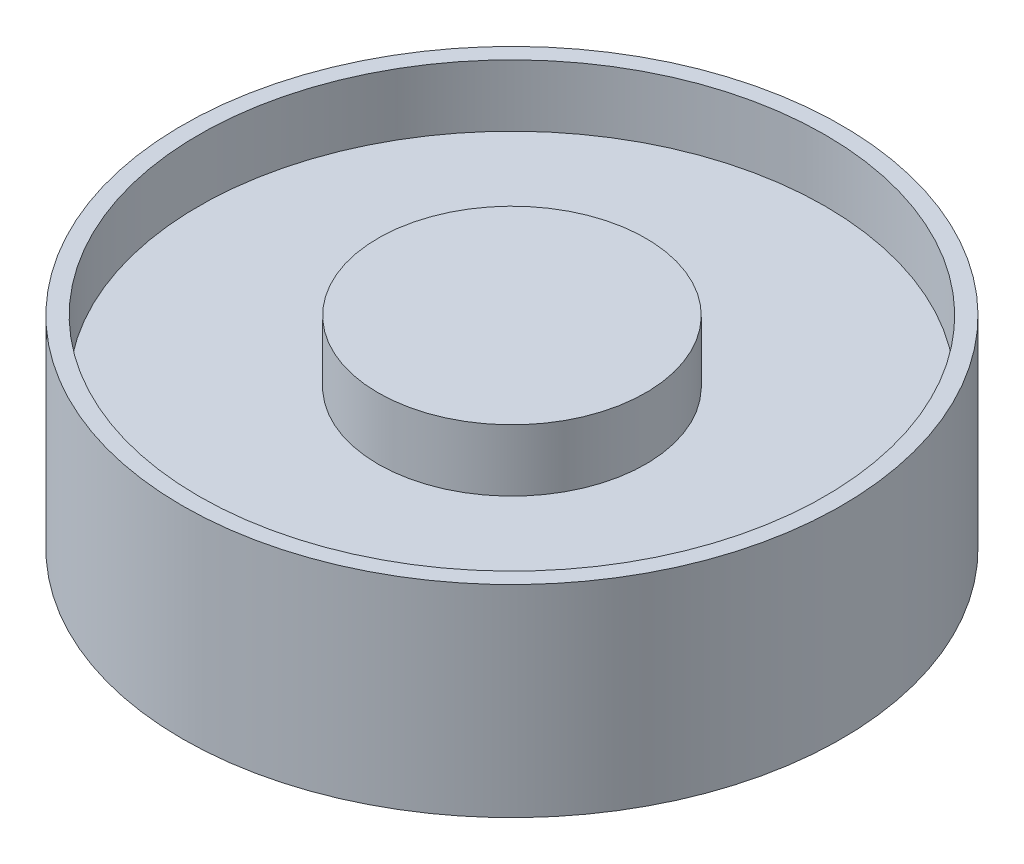
ISO-10303-21;
HEADER;
FILE_DESCRIPTION(('STEP AP214'),'2;1');
FILE_NAME('part.step','',(''),(''),'','','');
FILE_SCHEMA(('AUTOMOTIVE_DESIGN { 1 0 10303 214 1 1 1 1 }'));
ENDSEC;
DATA;
#1=APPLICATION_CONTEXT('core data for automotive mechanical design processes');
#2=APPLICATION_PROTOCOL_DEFINITION('international standard','automotive_design',2000,#1);
#3=PRODUCT_CONTEXT('',#1,'mechanical');
#4=PRODUCT('Part','Part','',(#3));
#5=PRODUCT_RELATED_PRODUCT_CATEGORY('part','',(#4));
#6=PRODUCT_DEFINITION_FORMATION('','',#4);
#7=PRODUCT_DEFINITION_CONTEXT('part definition',#1,'design');
#8=PRODUCT_DEFINITION('design','',#6,#7);
#9=PRODUCT_DEFINITION_SHAPE('','',#8);
#10=(LENGTH_UNIT() NAMED_UNIT(*) SI_UNIT(.MILLI.,.METRE.));
#11=(NAMED_UNIT(*) PLANE_ANGLE_UNIT() SI_UNIT($,.RADIAN.));
#12=(NAMED_UNIT(*) SI_UNIT($,.STERADIAN.) SOLID_ANGLE_UNIT());
#13=UNCERTAINTY_MEASURE_WITH_UNIT(LENGTH_MEASURE(1.E-05),#10,'distance_accuracy_value','');
#14=(GEOMETRIC_REPRESENTATION_CONTEXT(3) GLOBAL_UNCERTAINTY_ASSIGNED_CONTEXT((#13)) GLOBAL_UNIT_ASSIGNED_CONTEXT((#10,
#11,#12)) REPRESENTATION_CONTEXT('',''));
#15=CARTESIAN_POINT('',(0.,0.,0.));
#16=DIRECTION('',(0.,0.,1.));
#17=DIRECTION('',(1.,0.,0.));
#18=AXIS2_PLACEMENT_3D('',#15,#16,#17);
#19=CARTESIAN_POINT('',(0.,3.4,0.));
#20=DIRECTION('',(0.,-1.,0.));
#21=DIRECTION('',(0.,0.,-1.));
#22=AXIS2_PLACEMENT_3D('',#19,#20,#21);
#23=CYLINDRICAL_SURFACE('',#22,8.);
#24=CARTESIAN_POINT('',(0.,0.,0.));
#25=DIRECTION('',(0.,1.,0.));
#26=DIRECTION('',(0.,0.,1.));
#27=AXIS2_PLACEMENT_3D('',#24,#25,#26);
#28=CIRCLE('',#27,8.);
#29=CARTESIAN_POINT('',(0.,0.,8.));
#30=VERTEX_POINT('',#29);
#31=EDGE_CURVE('E45',#30,#30,#28,.T.);
#32=ORIENTED_EDGE('',*,*,#31,.T.);
#33=EDGE_LOOP('',(#32));
#34=FACE_BOUND('',#33,.T.);
#35=CARTESIAN_POINT('',(0.,4.9,0.));
#36=DIRECTION('',(0.,1.,0.));
#37=DIRECTION('',(0.,0.,1.));
#38=AXIS2_PLACEMENT_3D('',#35,#36,#37);
#39=CIRCLE('',#38,8.);
#40=CARTESIAN_POINT('',(0.,4.9,8.));
#41=VERTEX_POINT('',#40);
#42=EDGE_CURVE('E49',#41,#41,#39,.T.);
#43=ORIENTED_EDGE('',*,*,#42,.F.);
#44=EDGE_LOOP('',(#43));
#45=FACE_BOUND('',#44,.T.);
#46=ADVANCED_FACE('F39',(#34,#45),#23,.T.);
#47=CARTESIAN_POINT('',(0.,0.,0.));
#48=DIRECTION('',(0.,1.,0.));
#49=DIRECTION('',(0.,0.,1.));
#50=AXIS2_PLACEMENT_3D('',#47,#48,#49);
#51=PLANE('',#50);
#52=ORIENTED_EDGE('',*,*,#31,.F.);
#53=EDGE_LOOP('',(#52));
#54=FACE_BOUND('',#53,.T.);
#55=ADVANCED_FACE('F86',(#54),#51,.F.);
#56=CARTESIAN_POINT('',(0.,4.9,0.));
#57=DIRECTION('',(0.,-1.,0.));
#58=DIRECTION('',(0.,0.,-1.));
#59=AXIS2_PLACEMENT_3D('',#56,#57,#58);
#60=CYLINDRICAL_SURFACE('',#59,7.6);
#61=CARTESIAN_POINT('',(0.,4.9,0.));
#62=DIRECTION('',(0.,1.,0.));
#63=DIRECTION('',(0.,0.,1.));
#64=AXIS2_PLACEMENT_3D('',#61,#62,#63);
#65=CIRCLE('',#64,7.6);
#66=CARTESIAN_POINT('',(0.,4.9,7.6));
#67=VERTEX_POINT('',#66);
#68=EDGE_CURVE('E53',#67,#67,#65,.T.);
#69=ORIENTED_EDGE('',*,*,#68,.T.);
#70=EDGE_LOOP('',(#69));
#71=FACE_BOUND('',#70,.T.);
#72=CARTESIAN_POINT('',(0.,3.4,0.));
#73=DIRECTION('',(0.,1.,0.));
#74=DIRECTION('',(0.,0.,1.));
#75=AXIS2_PLACEMENT_3D('',#72,#73,#74);
#76=CIRCLE('',#75,7.6);
#77=CARTESIAN_POINT('',(0.,3.4,7.6));
#78=VERTEX_POINT('',#77);
#79=EDGE_CURVE('E11',#78,#78,#76,.F.);
#80=ORIENTED_EDGE('',*,*,#79,.T.);
#81=EDGE_LOOP('',(#80));
#82=FACE_BOUND('',#81,.T.);
#83=ADVANCED_FACE('F81',(#71,#82),#60,.F.);
#84=CARTESIAN_POINT('',(0.,4.9,0.));
#85=DIRECTION('',(0.,1.,0.));
#86=DIRECTION('',(0.,0.,1.));
#87=AXIS2_PLACEMENT_3D('',#84,#85,#86);
#88=PLANE('',#87);
#89=ORIENTED_EDGE('',*,*,#68,.F.);
#90=EDGE_LOOP('',(#89));
#91=FACE_BOUND('',#90,.T.);
#92=ORIENTED_EDGE('',*,*,#42,.T.);
#93=EDGE_LOOP('',(#92));
#94=FACE_BOUND('',#93,.T.);
#95=ADVANCED_FACE('F76',(#91,#94),#88,.T.);
#96=CARTESIAN_POINT('',(0.,3.4,0.));
#97=DIRECTION('',(0.,1.,0.));
#98=DIRECTION('',(0.,0.,1.));
#99=AXIS2_PLACEMENT_3D('',#96,#97,#98);
#100=PLANE('',#99);
#101=CARTESIAN_POINT('',(0.,3.4,0.));
#102=DIRECTION('',(0.,1.,0.));
#103=DIRECTION('',(0.,0.,1.));
#104=AXIS2_PLACEMENT_3D('',#101,#102,#103);
#105=CIRCLE('',#104,3.25);
#106=CARTESIAN_POINT('',(0.,3.4,3.25));
#107=VERTEX_POINT('',#106);
#108=EDGE_CURVE('E59',#107,#107,#105,.T.);
#109=ORIENTED_EDGE('',*,*,#108,.F.);
#110=EDGE_LOOP('',(#109));
#111=FACE_BOUND('',#110,.T.);
#112=ORIENTED_EDGE('',*,*,#79,.F.);
#113=EDGE_LOOP('',(#112));
#114=FACE_BOUND('',#113,.T.);
#115=ADVANCED_FACE('F70',(#111,#114),#100,.T.);
#116=CARTESIAN_POINT('',(0.,4.9,0.));
#117=DIRECTION('',(0.,-1.,0.));
#118=DIRECTION('',(0.,0.,-1.));
#119=AXIS2_PLACEMENT_3D('',#116,#117,#118);
#120=CYLINDRICAL_SURFACE('',#119,3.25);
#121=CARTESIAN_POINT('',(0.,4.9,0.));
#122=DIRECTION('',(0.,1.,0.));
#123=DIRECTION('',(0.,0.,1.));
#124=AXIS2_PLACEMENT_3D('',#121,#122,#123);
#125=CIRCLE('',#124,3.25);
#126=CARTESIAN_POINT('',(0.,4.9,3.25));
#127=VERTEX_POINT('',#126);
#128=EDGE_CURVE('E58',#127,#127,#125,.T.);
#129=ORIENTED_EDGE('',*,*,#128,.F.);
#130=EDGE_LOOP('',(#129));
#131=FACE_BOUND('',#130,.T.);
#132=ORIENTED_EDGE('',*,*,#108,.T.);
#133=EDGE_LOOP('',(#132));
#134=FACE_BOUND('',#133,.T.);
#135=ADVANCED_FACE('F67',(#131,#134),#120,.T.);
#136=CARTESIAN_POINT('',(0.,4.9,0.));
#137=DIRECTION('',(0.,1.,0.));
#138=DIRECTION('',(0.,0.,1.));
#139=AXIS2_PLACEMENT_3D('',#136,#137,#138);
#140=PLANE('',#139);
#141=ORIENTED_EDGE('',*,*,#128,.T.);
#142=EDGE_LOOP('',(#141));
#143=FACE_BOUND('',#142,.T.);
#144=ADVANCED_FACE('F65',(#143),#140,.T.);
#145=CLOSED_SHELL('',(#46,#55,#83,#95,#115,#135,#144));
#146=MANIFOLD_SOLID_BREP('B2',#145);
#147=ADVANCED_BREP_SHAPE_REPRESENTATION('',(#18,#146),#14);
#148=SHAPE_DEFINITION_REPRESENTATION(#9,#147);
ENDSEC;
END-ISO-10303-21;
